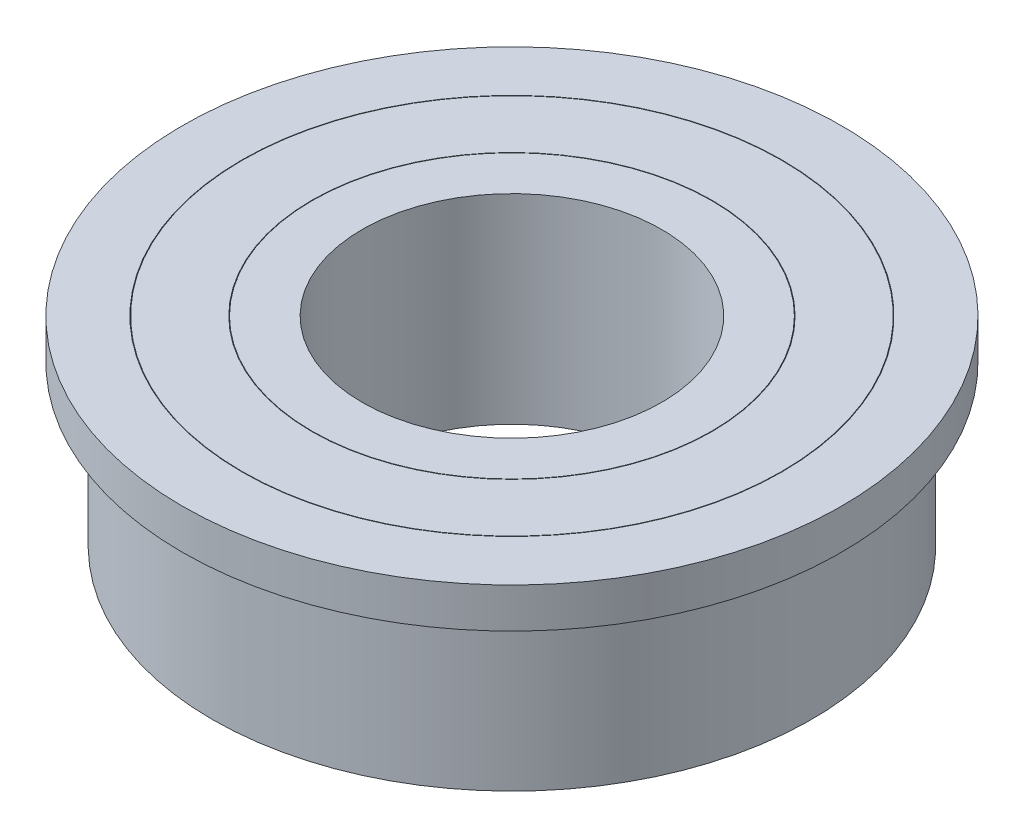
ISO-10303-21;
HEADER;
FILE_DESCRIPTION(('STEP AP214'),'2;1');
FILE_NAME('part.step','',(''),(''),'','','');
FILE_SCHEMA(('AUTOMOTIVE_DESIGN { 1 0 10303 214 1 1 1 1 }'));
ENDSEC;
DATA;
#1=APPLICATION_CONTEXT('core data for automotive mechanical design processes');
#2=APPLICATION_PROTOCOL_DEFINITION('international standard','automotive_design',2000,#1);
#3=PRODUCT_CONTEXT('',#1,'mechanical');
#4=PRODUCT('Part','Part','',(#3));
#5=PRODUCT_RELATED_PRODUCT_CATEGORY('part','',(#4));
#6=PRODUCT_DEFINITION_FORMATION('','',#4);
#7=PRODUCT_DEFINITION_CONTEXT('part definition',#1,'design');
#8=PRODUCT_DEFINITION('design','',#6,#7);
#9=PRODUCT_DEFINITION_SHAPE('','',#8);
#10=(LENGTH_UNIT() NAMED_UNIT(*) SI_UNIT(.MILLI.,.METRE.));
#11=(NAMED_UNIT(*) PLANE_ANGLE_UNIT() SI_UNIT($,.RADIAN.));
#12=(NAMED_UNIT(*) SI_UNIT($,.STERADIAN.) SOLID_ANGLE_UNIT());
#13=UNCERTAINTY_MEASURE_WITH_UNIT(LENGTH_MEASURE(1.E-05),#10,'distance_accuracy_value','');
#14=(GEOMETRIC_REPRESENTATION_CONTEXT(3) GLOBAL_UNCERTAINTY_ASSIGNED_CONTEXT((#13)) GLOBAL_UNIT_ASSIGNED_CONTEXT((#10,
#11,#12)) REPRESENTATION_CONTEXT('',''));
#15=CARTESIAN_POINT('',(0.,0.,0.));
#16=DIRECTION('',(0.,0.,1.));
#17=DIRECTION('',(1.,0.,0.));
#18=AXIS2_PLACEMENT_3D('',#15,#16,#17);
#19=CARTESIAN_POINT('',(0.,0.,-4.01));
#20=DIRECTION('',(0.,1.,0.));
#21=DIRECTION('',(0.,0.,-1.));
#22=AXIS2_PLACEMENT_3D('',#19,#20,#21);
#23=PLANE('',#22);
#24=CARTESIAN_POINT('',(0.,0.,0.));
#25=DIRECTION('',(0.,1.,0.));
#26=DIRECTION('',(0.,0.,1.));
#27=AXIS2_PLACEMENT_3D('',#24,#25,#26);
#28=CIRCLE('',#27,4.01);
#29=CARTESIAN_POINT('',(0.,0.,4.01));
#30=VERTEX_POINT('',#29);
#31=EDGE_CURVE('E58',#30,#30,#28,.T.);
#32=ORIENTED_EDGE('',*,*,#31,.T.);
#33=EDGE_LOOP('',(#32));
#34=FACE_BOUND('',#33,.T.);
#35=CARTESIAN_POINT('',(0.,0.,0.));
#36=DIRECTION('',(0.,1.,0.));
#37=DIRECTION('',(0.,0.,1.));
#38=AXIS2_PLACEMENT_3D('',#35,#36,#37);
#39=CIRCLE('',#38,5.4);
#40=CARTESIAN_POINT('',(0.,0.,5.4));
#41=VERTEX_POINT('',#40);
#42=EDGE_CURVE('E11',#41,#41,#39,.T.);
#43=ORIENTED_EDGE('',*,*,#42,.F.);
#44=EDGE_LOOP('',(#43));
#45=FACE_BOUND('',#44,.T.);
#46=ADVANCED_FACE('F44',(#34,#45),#23,.F.);
#47=CARTESIAN_POINT('',(0.,0.,0.));
#48=DIRECTION('',(0.,-1.,0.));
#49=DIRECTION('',(0.,0.,1.));
#50=AXIS2_PLACEMENT_3D('',#47,#48,#49);
#51=CYLINDRICAL_SURFACE('',#50,5.4);
#52=ORIENTED_EDGE('',*,*,#42,.T.);
#53=EDGE_LOOP('',(#52));
#54=FACE_BOUND('',#53,.T.);
#55=CARTESIAN_POINT('',(0.,4.,0.));
#56=DIRECTION('',(0.,1.,0.));
#57=DIRECTION('',(0.,0.,1.));
#58=AXIS2_PLACEMENT_3D('',#55,#56,#57);
#59=CIRCLE('',#58,5.4);
#60=CARTESIAN_POINT('',(0.,4.,5.4));
#61=VERTEX_POINT('',#60);
#62=EDGE_CURVE('E50',#61,#61,#59,.T.);
#63=ORIENTED_EDGE('',*,*,#62,.F.);
#64=EDGE_LOOP('',(#63));
#65=FACE_BOUND('',#64,.T.);
#66=ADVANCED_FACE('F74',(#54,#65),#51,.T.);
#67=CARTESIAN_POINT('',(0.,4.,-5.4));
#68=DIRECTION('',(0.,-1.,0.));
#69=DIRECTION('',(0.,0.,1.));
#70=AXIS2_PLACEMENT_3D('',#67,#68,#69);
#71=PLANE('',#70);
#72=ORIENTED_EDGE('',*,*,#62,.T.);
#73=EDGE_LOOP('',(#72));
#74=FACE_BOUND('',#73,.T.);
#75=CARTESIAN_POINT('',(0.,4.,0.));
#76=DIRECTION('',(0.,1.,0.));
#77=DIRECTION('',(0.,0.,1.));
#78=AXIS2_PLACEMENT_3D('',#75,#76,#77);
#79=CIRCLE('',#78,4.01);
#80=CARTESIAN_POINT('',(0.,4.,4.01));
#81=VERTEX_POINT('',#80);
#82=EDGE_CURVE('E54',#81,#81,#79,.T.);
#83=ORIENTED_EDGE('',*,*,#82,.F.);
#84=EDGE_LOOP('',(#83));
#85=FACE_BOUND('',#84,.T.);
#86=ADVANCED_FACE('F68',(#74,#85),#71,.F.);
#87=CARTESIAN_POINT('',(0.,0.,0.));
#88=DIRECTION('',(0.,-1.,0.));
#89=DIRECTION('',(0.,0.,1.));
#90=AXIS2_PLACEMENT_3D('',#87,#88,#89);
#91=CYLINDRICAL_SURFACE('',#90,4.01);
#92=ORIENTED_EDGE('',*,*,#82,.T.);
#93=EDGE_LOOP('',(#92));
#94=FACE_BOUND('',#93,.T.);
#95=ORIENTED_EDGE('',*,*,#31,.F.);
#96=EDGE_LOOP('',(#95));
#97=FACE_BOUND('',#96,.T.);
#98=ADVANCED_FACE('F66',(#94,#97),#91,.F.);
#99=CLOSED_SHELL('',(#46,#66,#86,#98));
#100=MANIFOLD_SOLID_BREP('B2',#99);
#101=CARTESIAN_POINT('',(0.,0.,0.));
#102=DIRECTION('',(0.,-1.,0.));
#103=DIRECTION('',(0.,0.,1.));
#104=AXIS2_PLACEMENT_3D('',#101,#102,#103);
#105=CYLINDRICAL_SURFACE('',#104,3.);
#106=CARTESIAN_POINT('',(0.,4.,0.));
#107=DIRECTION('',(0.,1.,0.));
#108=DIRECTION('',(0.,0.,1.));
#109=AXIS2_PLACEMENT_3D('',#106,#107,#108);
#110=CIRCLE('',#109,3.);
#111=CARTESIAN_POINT('',(0.,4.,3.));
#112=VERTEX_POINT('',#111);
#113=EDGE_CURVE('E127',#112,#112,#110,.T.);
#114=ORIENTED_EDGE('',*,*,#113,.T.);
#115=EDGE_LOOP('',(#114));
#116=FACE_BOUND('',#115,.T.);
#117=CARTESIAN_POINT('',(0.,0.,0.));
#118=DIRECTION('',(0.,1.,0.));
#119=DIRECTION('',(0.,0.,1.));
#120=AXIS2_PLACEMENT_3D('',#117,#118,#119);
#121=CIRCLE('',#120,3.);
#122=CARTESIAN_POINT('',(0.,0.,3.));
#123=VERTEX_POINT('',#122);
#124=EDGE_CURVE('E43',#123,#123,#121,.T.);
#125=ORIENTED_EDGE('',*,*,#124,.F.);
#126=EDGE_LOOP('',(#125));
#127=FACE_BOUND('',#126,.T.);
#128=ADVANCED_FACE('F113',(#116,#127),#105,.F.);
#129=CARTESIAN_POINT('',(0.,0.,-3.));
#130=DIRECTION('',(0.,1.,0.));
#131=DIRECTION('',(0.,0.,-1.));
#132=AXIS2_PLACEMENT_3D('',#129,#130,#131);
#133=PLANE('',#132);
#134=ORIENTED_EDGE('',*,*,#124,.T.);
#135=EDGE_LOOP('',(#134));
#136=FACE_BOUND('',#135,.T.);
#137=CARTESIAN_POINT('',(0.,0.,0.));
#138=DIRECTION('',(0.,1.,0.));
#139=DIRECTION('',(0.,0.,1.));
#140=AXIS2_PLACEMENT_3D('',#137,#138,#139);
#141=CIRCLE('',#140,4.);
#142=CARTESIAN_POINT('',(0.,0.,4.));
#143=VERTEX_POINT('',#142);
#144=EDGE_CURVE('E119',#143,#143,#141,.T.);
#145=ORIENTED_EDGE('',*,*,#144,.F.);
#146=EDGE_LOOP('',(#145));
#147=FACE_BOUND('',#146,.T.);
#148=ADVANCED_FACE('F143',(#136,#147),#133,.F.);
#149=CARTESIAN_POINT('',(0.,0.,0.));
#150=DIRECTION('',(0.,-1.,0.));
#151=DIRECTION('',(0.,0.,1.));
#152=AXIS2_PLACEMENT_3D('',#149,#150,#151);
#153=CYLINDRICAL_SURFACE('',#152,4.);
#154=ORIENTED_EDGE('',*,*,#144,.T.);
#155=EDGE_LOOP('',(#154));
#156=FACE_BOUND('',#155,.T.);
#157=CARTESIAN_POINT('',(0.,4.,0.));
#158=DIRECTION('',(0.,1.,0.));
#159=DIRECTION('',(0.,0.,1.));
#160=AXIS2_PLACEMENT_3D('',#157,#158,#159);
#161=CIRCLE('',#160,4.);
#162=CARTESIAN_POINT('',(0.,4.,4.));
#163=VERTEX_POINT('',#162);
#164=EDGE_CURVE('E123',#163,#163,#161,.T.);
#165=ORIENTED_EDGE('',*,*,#164,.F.);
#166=EDGE_LOOP('',(#165));
#167=FACE_BOUND('',#166,.T.);
#168=ADVANCED_FACE('F137',(#156,#167),#153,.T.);
#169=CARTESIAN_POINT('',(0.,4.,-4.));
#170=DIRECTION('',(0.,-1.,0.));
#171=DIRECTION('',(0.,0.,1.));
#172=AXIS2_PLACEMENT_3D('',#169,#170,#171);
#173=PLANE('',#172);
#174=ORIENTED_EDGE('',*,*,#164,.T.);
#175=EDGE_LOOP('',(#174));
#176=FACE_BOUND('',#175,.T.);
#177=ORIENTED_EDGE('',*,*,#113,.F.);
#178=EDGE_LOOP('',(#177));
#179=FACE_BOUND('',#178,.T.);
#180=ADVANCED_FACE('F135',(#176,#179),#173,.F.);
#181=CLOSED_SHELL('',(#128,#148,#168,#180));
#182=MANIFOLD_SOLID_BREP('B6',#181);
#183=CARTESIAN_POINT('',(0.,0.,-5.41));
#184=DIRECTION('',(0.,1.,0.));
#185=DIRECTION('',(0.,0.,-1.));
#186=AXIS2_PLACEMENT_3D('',#183,#184,#185);
#187=PLANE('',#186);
#188=CARTESIAN_POINT('',(0.,0.,0.));
#189=DIRECTION('',(0.,1.,0.));
#190=DIRECTION('',(0.,0.,1.));
#191=AXIS2_PLACEMENT_3D('',#188,#189,#190);
#192=CIRCLE('',#191,5.41);
#193=CARTESIAN_POINT('',(0.,0.,5.41));
#194=VERTEX_POINT('',#193);
#195=EDGE_CURVE('E197',#194,#194,#192,.T.);
#196=ORIENTED_EDGE('',*,*,#195,.T.);
#197=EDGE_LOOP('',(#196));
#198=FACE_BOUND('',#197,.T.);
#199=CARTESIAN_POINT('',(0.,0.,0.));
#200=DIRECTION('',(0.,1.,0.));
#201=DIRECTION('',(0.,0.,1.));
#202=AXIS2_PLACEMENT_3D('',#199,#200,#201);
#203=CIRCLE('',#202,6.);
#204=CARTESIAN_POINT('',(0.,0.,6.));
#205=VERTEX_POINT('',#204);
#206=EDGE_CURVE('E112',#205,#205,#203,.T.);
#207=ORIENTED_EDGE('',*,*,#206,.F.);
#208=EDGE_LOOP('',(#207));
#209=FACE_BOUND('',#208,.T.);
#210=ADVANCED_FACE('F175',(#198,#209),#187,.F.);
#211=CARTESIAN_POINT('',(0.,0.,0.));
#212=DIRECTION('',(0.,-1.,0.));
#213=DIRECTION('',(0.,0.,1.));
#214=AXIS2_PLACEMENT_3D('',#211,#212,#213);
#215=CYLINDRICAL_SURFACE('',#214,6.);
#216=ORIENTED_EDGE('',*,*,#206,.T.);
#217=EDGE_LOOP('',(#216));
#218=FACE_BOUND('',#217,.T.);
#219=CARTESIAN_POINT('',(0.,3.2,0.));
#220=DIRECTION('',(0.,1.,0.));
#221=DIRECTION('',(0.,0.,1.));
#222=AXIS2_PLACEMENT_3D('',#219,#220,#221);
#223=CIRCLE('',#222,6.);
#224=CARTESIAN_POINT('',(0.,3.2,6.));
#225=VERTEX_POINT('',#224);
#226=EDGE_CURVE('E181',#225,#225,#223,.T.);
#227=ORIENTED_EDGE('',*,*,#226,.F.);
#228=EDGE_LOOP('',(#227));
#229=FACE_BOUND('',#228,.T.);
#230=ADVANCED_FACE('F215',(#218,#229),#215,.T.);
#231=CARTESIAN_POINT('',(0.,3.2,-6.));
#232=DIRECTION('',(0.,1.,0.));
#233=DIRECTION('',(0.,0.,-1.));
#234=AXIS2_PLACEMENT_3D('',#231,#232,#233);
#235=PLANE('',#234);
#236=ORIENTED_EDGE('',*,*,#226,.T.);
#237=EDGE_LOOP('',(#236));
#238=FACE_BOUND('',#237,.T.);
#239=CARTESIAN_POINT('',(0.,3.2,0.));
#240=DIRECTION('',(0.,1.,0.));
#241=DIRECTION('',(0.,0.,1.));
#242=AXIS2_PLACEMENT_3D('',#239,#240,#241);
#243=CIRCLE('',#242,6.6);
#244=CARTESIAN_POINT('',(0.,3.2,6.6));
#245=VERTEX_POINT('',#244);
#246=EDGE_CURVE('E185',#245,#245,#243,.T.);
#247=ORIENTED_EDGE('',*,*,#246,.F.);
#248=EDGE_LOOP('',(#247));
#249=FACE_BOUND('',#248,.T.);
#250=ADVANCED_FACE('F219',(#238,#249),#235,.F.);
#251=CARTESIAN_POINT('',(0.,0.,0.));
#252=DIRECTION('',(0.,-1.,0.));
#253=DIRECTION('',(0.,0.,1.));
#254=AXIS2_PLACEMENT_3D('',#251,#252,#253);
#255=CYLINDRICAL_SURFACE('',#254,6.6);
#256=ORIENTED_EDGE('',*,*,#246,.T.);
#257=EDGE_LOOP('',(#256));
#258=FACE_BOUND('',#257,.T.);
#259=CARTESIAN_POINT('',(0.,4.,0.));
#260=DIRECTION('',(0.,1.,0.));
#261=DIRECTION('',(0.,0.,1.));
#262=AXIS2_PLACEMENT_3D('',#259,#260,#261);
#263=CIRCLE('',#262,6.6);
#264=CARTESIAN_POINT('',(0.,4.,6.6));
#265=VERTEX_POINT('',#264);
#266=EDGE_CURVE('E189',#265,#265,#263,.T.);
#267=ORIENTED_EDGE('',*,*,#266,.F.);
#268=EDGE_LOOP('',(#267));
#269=FACE_BOUND('',#268,.T.);
#270=ADVANCED_FACE('F211',(#258,#269),#255,.T.);
#271=CARTESIAN_POINT('',(0.,4.,-6.6));
#272=DIRECTION('',(0.,-1.,0.));
#273=DIRECTION('',(0.,0.,1.));
#274=AXIS2_PLACEMENT_3D('',#271,#272,#273);
#275=PLANE('',#274);
#276=ORIENTED_EDGE('',*,*,#266,.T.);
#277=EDGE_LOOP('',(#276));
#278=FACE_BOUND('',#277,.T.);
#279=CARTESIAN_POINT('',(0.,4.,0.));
#280=DIRECTION('',(0.,1.,0.));
#281=DIRECTION('',(0.,0.,1.));
#282=AXIS2_PLACEMENT_3D('',#279,#280,#281);
#283=CIRCLE('',#282,5.41);
#284=CARTESIAN_POINT('',(0.,4.,5.41));
#285=VERTEX_POINT('',#284);
#286=EDGE_CURVE('E194',#285,#285,#283,.T.);
#287=ORIENTED_EDGE('',*,*,#286,.F.);
#288=EDGE_LOOP('',(#287));
#289=FACE_BOUND('',#288,.T.);
#290=ADVANCED_FACE('F205',(#278,#289),#275,.F.);
#291=CARTESIAN_POINT('',(0.,0.,0.));
#292=DIRECTION('',(0.,-1.,0.));
#293=DIRECTION('',(0.,0.,1.));
#294=AXIS2_PLACEMENT_3D('',#291,#292,#293);
#295=CYLINDRICAL_SURFACE('',#294,5.41);
#296=ORIENTED_EDGE('',*,*,#286,.T.);
#297=EDGE_LOOP('',(#296));
#298=FACE_BOUND('',#297,.T.);
#299=ORIENTED_EDGE('',*,*,#195,.F.);
#300=EDGE_LOOP('',(#299));
#301=FACE_BOUND('',#300,.T.);
#302=ADVANCED_FACE('F203',(#298,#301),#295,.F.);
#303=CLOSED_SHELL('',(#210,#230,#250,#270,#290,#302));
#304=MANIFOLD_SOLID_BREP('B38',#303);
#305=ADVANCED_BREP_SHAPE_REPRESENTATION('',(#18,#100,#182,#304),#14);
#306=SHAPE_DEFINITION_REPRESENTATION(#9,#305);
ENDSEC;
END-ISO-10303-21;
